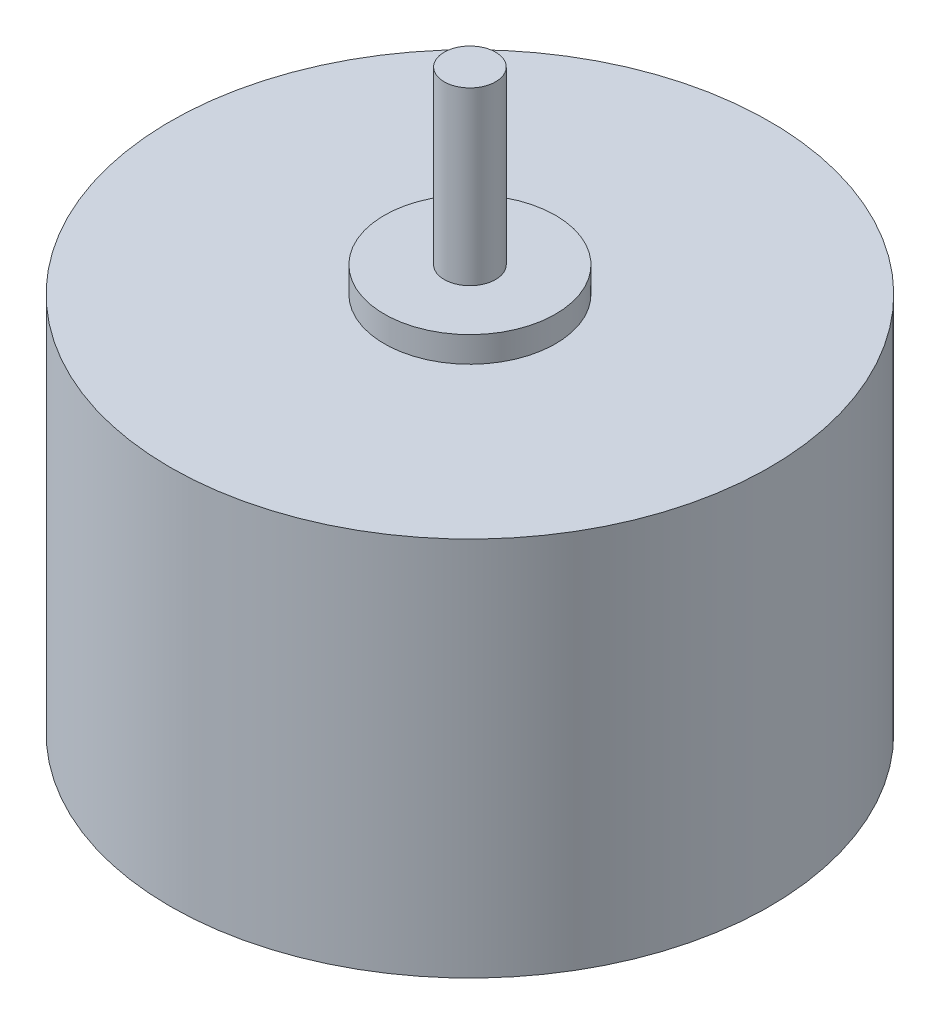
ISO-10303-21;
HEADER;
FILE_DESCRIPTION(('STEP AP214'),'2;1');
FILE_NAME('part.step','',(''),(''),'','','');
FILE_SCHEMA(('AUTOMOTIVE_DESIGN { 1 0 10303 214 1 1 1 1 }'));
ENDSEC;
DATA;
#1=APPLICATION_CONTEXT('core data for automotive mechanical design processes');
#2=APPLICATION_PROTOCOL_DEFINITION('international standard','automotive_design',2000,#1);
#3=PRODUCT_CONTEXT('',#1,'mechanical');
#4=PRODUCT('Part','Part','',(#3));
#5=PRODUCT_RELATED_PRODUCT_CATEGORY('part','',(#4));
#6=PRODUCT_DEFINITION_FORMATION('','',#4);
#7=PRODUCT_DEFINITION_CONTEXT('part definition',#1,'design');
#8=PRODUCT_DEFINITION('design','',#6,#7);
#9=PRODUCT_DEFINITION_SHAPE('','',#8);
#10=(LENGTH_UNIT() NAMED_UNIT(*) SI_UNIT(.MILLI.,.METRE.));
#11=(NAMED_UNIT(*) PLANE_ANGLE_UNIT() SI_UNIT($,.RADIAN.));
#12=(NAMED_UNIT(*) SI_UNIT($,.STERADIAN.) SOLID_ANGLE_UNIT());
#13=UNCERTAINTY_MEASURE_WITH_UNIT(LENGTH_MEASURE(1.E-05),#10,'distance_accuracy_value','');
#14=(GEOMETRIC_REPRESENTATION_CONTEXT(3) GLOBAL_UNCERTAINTY_ASSIGNED_CONTEXT((#13)) GLOBAL_UNIT_ASSIGNED_CONTEXT((#10,
#11,#12)) REPRESENTATION_CONTEXT('',''));
#15=CARTESIAN_POINT('',(0.,0.,0.));
#16=DIRECTION('',(0.,0.,1.));
#17=DIRECTION('',(1.,0.,0.));
#18=AXIS2_PLACEMENT_3D('',#15,#16,#17);
#19=CARTESIAN_POINT('',(0.,22.2,0.));
#20=DIRECTION('',(0.,-1.,0.));
#21=DIRECTION('',(0.,0.,-1.));
#22=AXIS2_PLACEMENT_3D('',#19,#20,#21);
#23=CYLINDRICAL_SURFACE('',#22,17.5);
#24=CARTESIAN_POINT('',(0.,22.2,0.));
#25=DIRECTION('',(0.,1.,0.));
#26=DIRECTION('',(0.,0.,1.));
#27=AXIS2_PLACEMENT_3D('',#24,#25,#26);
#28=CIRCLE('',#27,17.5);
#29=CARTESIAN_POINT('',(0.,22.2,17.5));
#30=VERTEX_POINT('',#29);
#31=EDGE_CURVE('E10',#30,#30,#28,.T.);
#32=ORIENTED_EDGE('',*,*,#31,.F.);
#33=EDGE_LOOP('',(#32));
#34=FACE_BOUND('',#33,.T.);
#35=CARTESIAN_POINT('',(0.,0.,0.));
#36=DIRECTION('',(0.,1.,0.));
#37=DIRECTION('',(0.,0.,1.));
#38=AXIS2_PLACEMENT_3D('',#35,#36,#37);
#39=CIRCLE('',#38,17.5);
#40=CARTESIAN_POINT('',(0.,0.,17.5));
#41=VERTEX_POINT('',#40);
#42=EDGE_CURVE('E51',#41,#41,#39,.T.);
#43=ORIENTED_EDGE('',*,*,#42,.T.);
#44=EDGE_LOOP('',(#43));
#45=FACE_BOUND('',#44,.T.);
#46=ADVANCED_FACE('F43',(#34,#45),#23,.T.);
#47=CARTESIAN_POINT('',(0.,22.2,0.));
#48=DIRECTION('',(0.,1.,0.));
#49=DIRECTION('',(0.,0.,1.));
#50=AXIS2_PLACEMENT_3D('',#47,#48,#49);
#51=PLANE('',#50);
#52=CARTESIAN_POINT('',(0.,22.2,0.));
#53=DIRECTION('',(0.,1.,0.));
#54=DIRECTION('',(0.,0.,1.));
#55=AXIS2_PLACEMENT_3D('',#52,#53,#54);
#56=CIRCLE('',#55,5.);
#57=CARTESIAN_POINT('',(0.,22.2,-5.));
#58=VERTEX_POINT('',#57);
#59=EDGE_CURVE('E60',#58,#58,#56,.F.);
#60=ORIENTED_EDGE('',*,*,#59,.T.);
#61=EDGE_LOOP('',(#60));
#62=FACE_BOUND('',#61,.T.);
#63=ORIENTED_EDGE('',*,*,#31,.T.);
#64=EDGE_LOOP('',(#63));
#65=FACE_BOUND('',#64,.T.);
#66=ADVANCED_FACE('F93',(#62,#65),#51,.T.);
#67=CARTESIAN_POINT('',(0.,0.,0.));
#68=DIRECTION('',(0.,1.,0.));
#69=DIRECTION('',(0.,0.,1.));
#70=AXIS2_PLACEMENT_3D('',#67,#68,#69);
#71=PLANE('',#70);
#72=ORIENTED_EDGE('',*,*,#42,.F.);
#73=EDGE_LOOP('',(#72));
#74=FACE_BOUND('',#73,.T.);
#75=ADVANCED_FACE('F96',(#74),#71,.F.);
#76=CARTESIAN_POINT('',(0.,23.7,0.));
#77=DIRECTION('',(0.,-1.,0.));
#78=DIRECTION('',(0.,0.,-1.));
#79=AXIS2_PLACEMENT_3D('',#76,#77,#78);
#80=CYLINDRICAL_SURFACE('',#79,5.);
#81=CARTESIAN_POINT('',(0.,23.7,0.));
#82=DIRECTION('',(0.,1.,0.));
#83=DIRECTION('',(0.,0.,1.));
#84=AXIS2_PLACEMENT_3D('',#81,#82,#83);
#85=CIRCLE('',#84,5.);
#86=CARTESIAN_POINT('',(0.,23.7,-5.));
#87=VERTEX_POINT('',#86);
#88=EDGE_CURVE('E65',#87,#87,#85,.T.);
#89=CARTESIAN_POINT('',(0.,22.2,-5.));
#90=CARTESIAN_POINT('',(0.,22.215625,-5.));
#91=CARTESIAN_POINT('',(0.,22.23125,-5.));
#92=CARTESIAN_POINT('',(0.,22.2625,-5.));
#93=CARTESIAN_POINT('',(0.,22.278125,-5.));
#94=CARTESIAN_POINT('',(0.,22.309375,-5.));
#95=CARTESIAN_POINT('',(0.,22.325,-5.));
#96=CARTESIAN_POINT('',(0.,22.35625,-5.));
#97=CARTESIAN_POINT('',(0.,22.371875,-5.));
#98=CARTESIAN_POINT('',(0.,22.403125,-5.));
#99=CARTESIAN_POINT('',(0.,22.41875,-5.));
#100=CARTESIAN_POINT('',(0.,22.45,-5.));
#101=CARTESIAN_POINT('',(0.,22.465625,-5.));
#102=CARTESIAN_POINT('',(0.,22.496875,-5.));
#103=CARTESIAN_POINT('',(0.,22.5125,-5.));
#104=CARTESIAN_POINT('',(0.,22.54375,-5.));
#105=CARTESIAN_POINT('',(0.,22.559375,-5.));
#106=CARTESIAN_POINT('',(0.,22.590625,-5.));
#107=CARTESIAN_POINT('',(0.,22.60625,-5.));
#108=CARTESIAN_POINT('',(0.,22.6375,-5.));
#109=CARTESIAN_POINT('',(0.,22.653125,-5.));
#110=CARTESIAN_POINT('',(0.,22.684375,-5.));
#111=CARTESIAN_POINT('',(0.,22.7,-5.));
#112=CARTESIAN_POINT('',(0.,22.73125,-5.));
#113=CARTESIAN_POINT('',(0.,22.746875,-5.));
#114=CARTESIAN_POINT('',(0.,22.778125,-5.));
#115=CARTESIAN_POINT('',(0.,22.79375,-5.));
#116=CARTESIAN_POINT('',(0.,22.825,-5.));
#117=CARTESIAN_POINT('',(0.,22.840625,-5.));
#118=CARTESIAN_POINT('',(0.,22.871875,-5.));
#119=CARTESIAN_POINT('',(0.,22.8875,-5.));
#120=CARTESIAN_POINT('',(0.,22.91875,-5.));
#121=CARTESIAN_POINT('',(0.,22.934375,-5.));
#122=CARTESIAN_POINT('',(0.,22.965625,-5.));
#123=CARTESIAN_POINT('',(0.,22.98125,-5.));
#124=CARTESIAN_POINT('',(0.,23.0125,-5.));
#125=CARTESIAN_POINT('',(0.,23.028125,-5.));
#126=CARTESIAN_POINT('',(0.,23.059375,-5.));
#127=CARTESIAN_POINT('',(0.,23.075,-5.));
#128=CARTESIAN_POINT('',(0.,23.10625,-5.));
#129=CARTESIAN_POINT('',(0.,23.121875,-5.));
#130=CARTESIAN_POINT('',(0.,23.153125,-5.));
#131=CARTESIAN_POINT('',(0.,23.16875,-5.));
#132=CARTESIAN_POINT('',(0.,23.2,-5.));
#133=CARTESIAN_POINT('',(0.,23.215625,-5.));
#134=CARTESIAN_POINT('',(0.,23.246875,-5.));
#135=CARTESIAN_POINT('',(0.,23.2625,-5.));
#136=CARTESIAN_POINT('',(0.,23.29375,-5.));
#137=CARTESIAN_POINT('',(0.,23.309375,-5.));
#138=CARTESIAN_POINT('',(0.,23.340625,-5.));
#139=CARTESIAN_POINT('',(0.,23.35625,-5.));
#140=CARTESIAN_POINT('',(0.,23.3875,-5.));
#141=CARTESIAN_POINT('',(0.,23.403125,-5.));
#142=CARTESIAN_POINT('',(0.,23.434375,-5.));
#143=CARTESIAN_POINT('',(0.,23.45,-5.));
#144=CARTESIAN_POINT('',(0.,23.48125,-5.));
#145=CARTESIAN_POINT('',(0.,23.496875,-5.));
#146=CARTESIAN_POINT('',(0.,23.528125,-5.));
#147=CARTESIAN_POINT('',(0.,23.54375,-5.));
#148=CARTESIAN_POINT('',(0.,23.575,-5.));
#149=CARTESIAN_POINT('',(0.,23.590625,-5.));
#150=CARTESIAN_POINT('',(0.,23.621875,-5.));
#151=CARTESIAN_POINT('',(0.,23.6375,-5.));
#152=CARTESIAN_POINT('',(0.,23.66875,-5.));
#153=CARTESIAN_POINT('',(0.,23.684375,-5.));
#154=CARTESIAN_POINT('',(0.,23.7,-5.));
#155=B_SPLINE_CURVE_WITH_KNOTS('',3,(#89,#90,#91,#92,#93,#94,#95,#96,#97,#98,#99,#100,#101,#102,
#103,#104,#105,#106,#107,#108,#109,#110,#111,#112,#113,#114,#115,#116,#117,#118,#119,#120,#121,
#122,#123,#124,#125,#126,#127,#128,#129,#130,#131,#132,#133,#134,#135,#136,#137,#138,#139,#140,
#141,#142,#143,#144,#145,#146,#147,#148,#149,#150,#151,#152,#153,#154),.UNSPECIFIED.,.F.,.F.,(4,
2,2,2,2,2,2,2,2,2,2,2,2,2,2,2,2,2,2,2,2,2,2,2,2,2,2,2,2,2,2,2,4),(0.,0.0468749999999983,
0.0937500000000001,0.140624999999998,0.1875,0.234374999999998,0.28125,0.328124999999999,0.375,
0.421874999999999,0.46875,0.515624999999999,0.5625,0.609374999999999,0.656250000000001,
0.703124999999999,0.750000000000001,0.796874999999999,0.843750000000001,0.890624999999999,
0.937500000000001,0.984374999999999,1.03125,1.078125,1.125,1.171875,1.21875,1.265625,1.3125,
1.359375,1.40625,1.453125,1.5),.UNSPECIFIED.);
#156=EDGE_CURVE('BSEAM86',#58,#87,#155,.T.);
#157=ORIENTED_EDGE('',*,*,#59,.F.);
#158=ORIENTED_EDGE('',*,*,#88,.F.);
#159=ORIENTED_EDGE('',*,*,#156,.T.);
#160=ORIENTED_EDGE('',*,*,#156,.F.);
#161=EDGE_LOOP('',(#157,#159,#158,#160));
#162=FACE_BOUND('',#161,.T.);
#163=ADVANCED_FACE('F86',(#162),#80,.T.);
#164=CARTESIAN_POINT('',(0.,23.7,0.));
#165=DIRECTION('',(0.,1.,0.));
#166=DIRECTION('',(0.,0.,1.));
#167=AXIS2_PLACEMENT_3D('',#164,#165,#166);
#168=PLANE('',#167);
#169=CARTESIAN_POINT('',(0.,23.7,0.));
#170=DIRECTION('',(0.,1.,0.));
#171=DIRECTION('',(0.,0.,1.));
#172=AXIS2_PLACEMENT_3D('',#169,#170,#171);
#173=CIRCLE('',#172,1.5);
#174=CARTESIAN_POINT('',(0.,23.7,1.5));
#175=VERTEX_POINT('',#174);
#176=EDGE_CURVE('E46',#175,#175,#173,.F.);
#177=ORIENTED_EDGE('',*,*,#176,.T.);
#178=EDGE_LOOP('',(#177));
#179=FACE_BOUND('',#178,.T.);
#180=ORIENTED_EDGE('',*,*,#88,.T.);
#181=EDGE_LOOP('',(#180));
#182=FACE_BOUND('',#181,.T.);
#183=ADVANCED_FACE('F73',(#179,#182),#168,.T.);
#184=CARTESIAN_POINT('',(0.,33.7,0.));
#185=DIRECTION('',(0.,-1.,0.));
#186=DIRECTION('',(0.,0.,-1.));
#187=AXIS2_PLACEMENT_3D('',#184,#185,#186);
#188=CYLINDRICAL_SURFACE('',#187,1.5);
#189=ORIENTED_EDGE('',*,*,#176,.F.);
#190=EDGE_LOOP('',(#189));
#191=FACE_BOUND('',#190,.T.);
#192=CARTESIAN_POINT('',(0.,33.7,0.));
#193=DIRECTION('',(0.,1.,0.));
#194=DIRECTION('',(0.,0.,1.));
#195=AXIS2_PLACEMENT_3D('',#192,#193,#194);
#196=CIRCLE('',#195,1.5);
#197=CARTESIAN_POINT('',(0.,33.7,1.5));
#198=VERTEX_POINT('',#197);
#199=EDGE_CURVE('E67',#198,#198,#196,.T.);
#200=ORIENTED_EDGE('',*,*,#199,.F.);
#201=EDGE_LOOP('',(#200));
#202=FACE_BOUND('',#201,.T.);
#203=ADVANCED_FACE('F79',(#191,#202),#188,.T.);
#204=CARTESIAN_POINT('',(0.,33.7,0.));
#205=DIRECTION('',(0.,1.,0.));
#206=DIRECTION('',(0.,0.,1.));
#207=AXIS2_PLACEMENT_3D('',#204,#205,#206);
#208=PLANE('',#207);
#209=ORIENTED_EDGE('',*,*,#199,.T.);
#210=EDGE_LOOP('',(#209));
#211=FACE_BOUND('',#210,.T.);
#212=ADVANCED_FACE('F82',(#211),#208,.T.);
#213=CLOSED_SHELL('',(#46,#66,#75,#163,#183,#203,#212));
#214=MANIFOLD_SOLID_BREP('B2',#213);
#215=ADVANCED_BREP_SHAPE_REPRESENTATION('',(#18,#214),#14);
#216=SHAPE_DEFINITION_REPRESENTATION(#9,#215);
ENDSEC;
END-ISO-10303-21;
